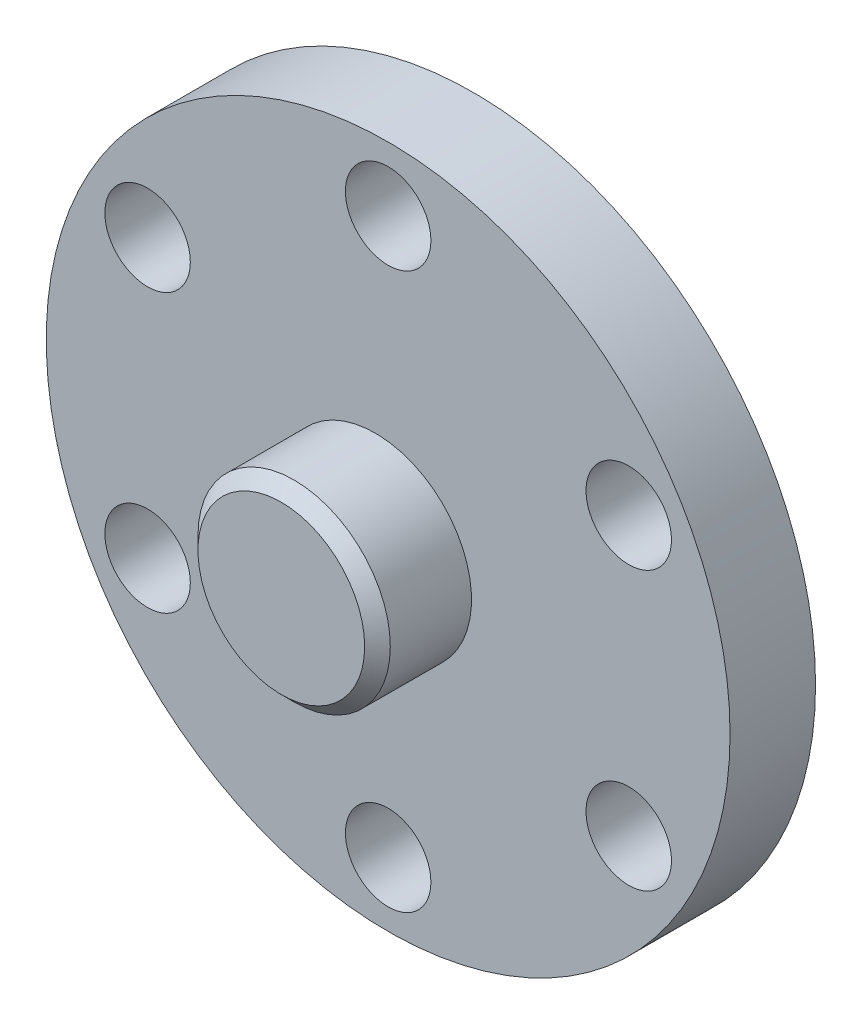
ISO-10303-21;
HEADER;
FILE_DESCRIPTION(('STEP AP214'),'2;1');
FILE_NAME('part.step','',(''),(''),'','','');
FILE_SCHEMA(('AUTOMOTIVE_DESIGN { 1 0 10303 214 1 1 1 1 }'));
ENDSEC;
DATA;
#1=APPLICATION_CONTEXT('core data for automotive mechanical design processes');
#2=APPLICATION_PROTOCOL_DEFINITION('international standard','automotive_design',2000,#1);
#3=PRODUCT_CONTEXT('',#1,'mechanical');
#4=PRODUCT('Part','Part','',(#3));
#5=PRODUCT_RELATED_PRODUCT_CATEGORY('part','',(#4));
#6=PRODUCT_DEFINITION_FORMATION('','',#4);
#7=PRODUCT_DEFINITION_CONTEXT('part definition',#1,'design');
#8=PRODUCT_DEFINITION('design','',#6,#7);
#9=PRODUCT_DEFINITION_SHAPE('','',#8);
#10=(LENGTH_UNIT() NAMED_UNIT(*) SI_UNIT(.MILLI.,.METRE.));
#11=(NAMED_UNIT(*) PLANE_ANGLE_UNIT() SI_UNIT($,.RADIAN.));
#12=(NAMED_UNIT(*) SI_UNIT($,.STERADIAN.) SOLID_ANGLE_UNIT());
#13=UNCERTAINTY_MEASURE_WITH_UNIT(LENGTH_MEASURE(1.E-05),#10,'distance_accuracy_value','');
#14=(GEOMETRIC_REPRESENTATION_CONTEXT(3) GLOBAL_UNCERTAINTY_ASSIGNED_CONTEXT((#13)) GLOBAL_UNIT_ASSIGNED_CONTEXT((#10,
#11,#12)) REPRESENTATION_CONTEXT('',''));
#15=CARTESIAN_POINT('',(0.,0.,0.));
#16=DIRECTION('',(0.,0.,1.));
#17=DIRECTION('',(1.,0.,0.));
#18=AXIS2_PLACEMENT_3D('',#15,#16,#17);
#19=CARTESIAN_POINT('',(0.,0.,20.));
#20=DIRECTION('',(0.,0.,-1.));
#21=DIRECTION('',(-1.,0.,0.));
#22=AXIS2_PLACEMENT_3D('',#19,#20,#21);
#23=CYLINDRICAL_SURFACE('',#22,80.);
#24=CARTESIAN_POINT('',(0.,0.,20.));
#25=DIRECTION('',(0.,0.,1.));
#26=DIRECTION('',(1.,0.,0.));
#27=AXIS2_PLACEMENT_3D('',#24,#25,#26);
#28=CIRCLE('',#27,80.);
#29=CARTESIAN_POINT('',(80.,0.,20.));
#30=VERTEX_POINT('',#29);
#31=EDGE_CURVE('E45',#30,#30,#28,.T.);
#32=ORIENTED_EDGE('',*,*,#31,.F.);
#33=EDGE_LOOP('',(#32));
#34=FACE_BOUND('',#33,.T.);
#35=CARTESIAN_POINT('',(0.,0.,0.));
#36=DIRECTION('',(0.,0.,1.));
#37=DIRECTION('',(1.,0.,0.));
#38=AXIS2_PLACEMENT_3D('',#35,#36,#37);
#39=CIRCLE('',#38,80.);
#40=CARTESIAN_POINT('',(80.,0.,0.));
#41=VERTEX_POINT('',#40);
#42=EDGE_CURVE('E48',#41,#41,#39,.T.);
#43=ORIENTED_EDGE('',*,*,#42,.T.);
#44=EDGE_LOOP('',(#43));
#45=FACE_BOUND('',#44,.T.);
#46=ADVANCED_FACE('F30',(#34,#45),#23,.T.);
#47=CARTESIAN_POINT('',(0.,0.,20.));
#48=DIRECTION('',(0.,0.,1.));
#49=DIRECTION('',(1.,0.,0.));
#50=AXIS2_PLACEMENT_3D('',#47,#48,#49);
#51=PLANE('',#50);
#52=CARTESIAN_POINT('',(-56.2916512459881,32.5000000000007,20.));
#53=DIRECTION('',(0.,0.,1.));
#54=DIRECTION('',(1.,0.,0.));
#55=AXIS2_PLACEMENT_3D('',#52,#53,#54);
#56=CIRCLE('',#55,10.);
#57=CARTESIAN_POINT('',(-46.2916512459881,32.5000000000007,20.));
#58=VERTEX_POINT('',#57);
#59=EDGE_CURVE('E92',#58,#58,#56,.T.);
#60=ORIENTED_EDGE('',*,*,#59,.F.);
#61=EDGE_LOOP('',(#60));
#62=FACE_BOUND('',#61,.T.);
#63=CARTESIAN_POINT('',(-56.2916512459888,-32.4999999999995,20.));
#64=DIRECTION('',(0.,0.,1.));
#65=DIRECTION('',(1.,0.,0.));
#66=AXIS2_PLACEMENT_3D('',#63,#64,#65);
#67=CIRCLE('',#66,9.99999999999999);
#68=CARTESIAN_POINT('',(-46.2916512459888,-32.4999999999995,20.));
#69=VERTEX_POINT('',#68);
#70=EDGE_CURVE('E86',#69,#69,#67,.T.);
#71=ORIENTED_EDGE('',*,*,#70,.F.);
#72=EDGE_LOOP('',(#71));
#73=FACE_BOUND('',#72,.T.);
#74=CARTESIAN_POINT('',(-4.53892574049607E-13,-65.,20.));
#75=DIRECTION('',(0.,0.,1.));
#76=DIRECTION('',(1.,0.,0.));
#77=AXIS2_PLACEMENT_3D('',#74,#75,#76);
#78=CIRCLE('',#77,10.);
#79=CARTESIAN_POINT('',(9.99999999999954,-65.,20.));
#80=VERTEX_POINT('',#79);
#81=EDGE_CURVE('E80',#80,#80,#78,.T.);
#82=ORIENTED_EDGE('',*,*,#81,.F.);
#83=EDGE_LOOP('',(#82));
#84=FACE_BOUND('',#83,.T.);
#85=CARTESIAN_POINT('',(56.2916512459884,-32.5000000000003,20.));
#86=DIRECTION('',(0.,0.,1.));
#87=DIRECTION('',(1.,0.,0.));
#88=AXIS2_PLACEMENT_3D('',#85,#86,#87);
#89=CIRCLE('',#88,10.);
#90=CARTESIAN_POINT('',(66.2916512459884,-32.5000000000003,20.));
#91=VERTEX_POINT('',#90);
#92=EDGE_CURVE('E74',#91,#91,#89,.T.);
#93=ORIENTED_EDGE('',*,*,#92,.F.);
#94=EDGE_LOOP('',(#93));
#95=FACE_BOUND('',#94,.T.);
#96=CARTESIAN_POINT('',(56.2916512459886,32.4999999999999,20.));
#97=DIRECTION('',(0.,0.,1.));
#98=DIRECTION('',(1.,0.,0.));
#99=AXIS2_PLACEMENT_3D('',#96,#97,#98);
#100=CIRCLE('',#99,9.99999999999999);
#101=CARTESIAN_POINT('',(66.2916512459886,32.4999999999999,20.));
#102=VERTEX_POINT('',#101);
#103=EDGE_CURVE('E68',#102,#102,#100,.T.);
#104=ORIENTED_EDGE('',*,*,#103,.F.);
#105=EDGE_LOOP('',(#104));
#106=FACE_BOUND('',#105,.T.);
#107=CARTESIAN_POINT('',(0.,65.,20.));
#108=DIRECTION('',(0.,0.,1.));
#109=DIRECTION('',(1.,0.,0.));
#110=AXIS2_PLACEMENT_3D('',#107,#108,#109);
#111=CIRCLE('',#110,10.);
#112=CARTESIAN_POINT('',(10.,65.,20.));
#113=VERTEX_POINT('',#112);
#114=EDGE_CURVE('E62',#113,#113,#111,.T.);
#115=ORIENTED_EDGE('',*,*,#114,.F.);
#116=EDGE_LOOP('',(#115));
#117=FACE_BOUND('',#116,.T.);
#118=CARTESIAN_POINT('',(0.,0.,20.));
#119=DIRECTION('',(0.,0.,1.));
#120=DIRECTION('',(1.,0.,0.));
#121=AXIS2_PLACEMENT_3D('',#118,#119,#120);
#122=CIRCLE('',#121,10.);
#123=CARTESIAN_POINT('',(10.,0.,20.));
#124=VERTEX_POINT('',#123);
#125=EDGE_CURVE('E41',#124,#124,#122,.T.);
#126=ORIENTED_EDGE('',*,*,#125,.F.);
#127=EDGE_LOOP('',(#126));
#128=FACE_BOUND('',#127,.T.);
#129=ORIENTED_EDGE('',*,*,#31,.T.);
#130=EDGE_LOOP('',(#129));
#131=FACE_BOUND('',#130,.T.);
#132=ADVANCED_FACE('F98',(#62,#73,#84,#95,#106,#117,#128,#131),#51,.T.);
#133=CARTESIAN_POINT('',(0.,0.,0.));
#134=DIRECTION('',(0.,0.,1.));
#135=DIRECTION('',(1.,0.,0.));
#136=AXIS2_PLACEMENT_3D('',#133,#134,#135);
#137=PLANE('',#136);
#138=CARTESIAN_POINT('',(-56.2916512459881,32.5000000000007,0.));
#139=DIRECTION('',(0.,0.,1.));
#140=DIRECTION('',(1.,0.,0.));
#141=AXIS2_PLACEMENT_3D('',#138,#139,#140);
#142=CIRCLE('',#141,9.99999999999999);
#143=CARTESIAN_POINT('',(-46.2916512459881,32.5000000000007,0.));
#144=VERTEX_POINT('',#143);
#145=EDGE_CURVE('E89',#144,#144,#142,.T.);
#146=ORIENTED_EDGE('',*,*,#145,.T.);
#147=EDGE_LOOP('',(#146));
#148=FACE_BOUND('',#147,.T.);
#149=CARTESIAN_POINT('',(-56.2916512459888,-32.4999999999995,0.));
#150=DIRECTION('',(0.,0.,1.));
#151=DIRECTION('',(1.,0.,0.));
#152=AXIS2_PLACEMENT_3D('',#149,#150,#151);
#153=CIRCLE('',#152,9.99999999999999);
#154=CARTESIAN_POINT('',(-46.2916512459888,-32.4999999999995,0.));
#155=VERTEX_POINT('',#154);
#156=EDGE_CURVE('E83',#155,#155,#153,.T.);
#157=ORIENTED_EDGE('',*,*,#156,.T.);
#158=EDGE_LOOP('',(#157));
#159=FACE_BOUND('',#158,.T.);
#160=CARTESIAN_POINT('',(-4.53892574049607E-13,-65.,0.));
#161=DIRECTION('',(0.,0.,1.));
#162=DIRECTION('',(1.,0.,0.));
#163=AXIS2_PLACEMENT_3D('',#160,#161,#162);
#164=CIRCLE('',#163,10.);
#165=CARTESIAN_POINT('',(9.99999999999954,-65.,0.));
#166=VERTEX_POINT('',#165);
#167=EDGE_CURVE('E77',#166,#166,#164,.T.);
#168=ORIENTED_EDGE('',*,*,#167,.T.);
#169=EDGE_LOOP('',(#168));
#170=FACE_BOUND('',#169,.T.);
#171=CARTESIAN_POINT('',(56.2916512459884,-32.5000000000003,0.));
#172=DIRECTION('',(0.,0.,1.));
#173=DIRECTION('',(1.,0.,0.));
#174=AXIS2_PLACEMENT_3D('',#171,#172,#173);
#175=CIRCLE('',#174,10.);
#176=CARTESIAN_POINT('',(66.2916512459884,-32.5000000000003,0.));
#177=VERTEX_POINT('',#176);
#178=EDGE_CURVE('E71',#177,#177,#175,.T.);
#179=ORIENTED_EDGE('',*,*,#178,.T.);
#180=EDGE_LOOP('',(#179));
#181=FACE_BOUND('',#180,.T.);
#182=CARTESIAN_POINT('',(56.2916512459886,32.4999999999999,0.));
#183=DIRECTION('',(0.,0.,1.));
#184=DIRECTION('',(1.,0.,0.));
#185=AXIS2_PLACEMENT_3D('',#182,#183,#184);
#186=CIRCLE('',#185,9.99999999999999);
#187=CARTESIAN_POINT('',(66.2916512459886,32.4999999999999,0.));
#188=VERTEX_POINT('',#187);
#189=EDGE_CURVE('E65',#188,#188,#186,.T.);
#190=ORIENTED_EDGE('',*,*,#189,.T.);
#191=EDGE_LOOP('',(#190));
#192=FACE_BOUND('',#191,.T.);
#193=CARTESIAN_POINT('',(0.,65.,0.));
#194=DIRECTION('',(0.,0.,1.));
#195=DIRECTION('',(1.,0.,0.));
#196=AXIS2_PLACEMENT_3D('',#193,#194,#195);
#197=CIRCLE('',#196,10.);
#198=CARTESIAN_POINT('',(10.,65.,0.));
#199=VERTEX_POINT('',#198);
#200=EDGE_CURVE('E59',#199,#199,#197,.T.);
#201=ORIENTED_EDGE('',*,*,#200,.T.);
#202=EDGE_LOOP('',(#201));
#203=FACE_BOUND('',#202,.T.);
#204=ORIENTED_EDGE('',*,*,#42,.F.);
#205=EDGE_LOOP('',(#204));
#206=FACE_BOUND('',#205,.T.);
#207=ADVANCED_FACE('F101',(#148,#159,#170,#181,#192,#203,#206),#137,.F.);
#208=CARTESIAN_POINT('',(-22.5,0.,45.));
#209=DIRECTION('',(0.,0.,1.));
#210=DIRECTION('',(1.,0.,0.));
#211=AXIS2_PLACEMENT_3D('',#208,#209,#210);
#212=PLANE('',#211);
#213=CARTESIAN_POINT('',(0.,0.,45.));
#214=DIRECTION('',(0.,0.,1.));
#215=DIRECTION('',(1.,0.,0.));
#216=AXIS2_PLACEMENT_3D('',#213,#214,#215);
#217=CIRCLE('',#216,19.5);
#218=CARTESIAN_POINT('',(19.5,0.,45.));
#219=VERTEX_POINT('',#218);
#220=EDGE_CURVE('E10',#219,#219,#217,.T.);
#221=ORIENTED_EDGE('',*,*,#220,.T.);
#222=EDGE_LOOP('',(#221));
#223=FACE_BOUND('',#222,.T.);
#224=ADVANCED_FACE('F122',(#223),#212,.T.);
#225=CARTESIAN_POINT('',(0.,0.,0.));
#226=DIRECTION('',(0.,0.,-1.));
#227=DIRECTION('',(-1.,0.,0.));
#228=AXIS2_PLACEMENT_3D('',#225,#226,#227);
#229=CYLINDRICAL_SURFACE('',#228,22.5);
#230=CARTESIAN_POINT('',(0.,0.,42.));
#231=DIRECTION('',(0.,0.,1.));
#232=DIRECTION('',(1.,0.,0.));
#233=AXIS2_PLACEMENT_3D('',#230,#231,#232);
#234=CIRCLE('',#233,22.5);
#235=CARTESIAN_POINT('',(22.5,0.,42.));
#236=VERTEX_POINT('',#235);
#237=EDGE_CURVE('E37',#236,#236,#234,.F.);
#238=ORIENTED_EDGE('',*,*,#237,.T.);
#239=EDGE_LOOP('',(#238));
#240=FACE_BOUND('',#239,.T.);
#241=CARTESIAN_POINT('',(0.,0.,23.));
#242=DIRECTION('',(0.,0.,-1.));
#243=DIRECTION('',(-1.,0.,0.));
#244=AXIS2_PLACEMENT_3D('',#241,#242,#243);
#245=CIRCLE('',#244,22.5);
#246=CARTESIAN_POINT('',(-22.5,0.,23.));
#247=VERTEX_POINT('',#246);
#248=EDGE_CURVE('E51',#247,#247,#245,.T.);
#249=ORIENTED_EDGE('',*,*,#248,.F.);
#250=EDGE_LOOP('',(#249));
#251=FACE_BOUND('',#250,.T.);
#252=ADVANCED_FACE('F128',(#240,#251),#229,.T.);
#253=CARTESIAN_POINT('',(-10.,0.,23.));
#254=DIRECTION('',(0.,0.,-1.));
#255=DIRECTION('',(-1.,0.,0.));
#256=AXIS2_PLACEMENT_3D('',#253,#254,#255);
#257=PLANE('',#256);
#258=ORIENTED_EDGE('',*,*,#248,.T.);
#259=EDGE_LOOP('',(#258));
#260=FACE_BOUND('',#259,.T.);
#261=CARTESIAN_POINT('',(0.,0.,23.));
#262=DIRECTION('',(0.,0.,-1.));
#263=DIRECTION('',(-1.,0.,0.));
#264=AXIS2_PLACEMENT_3D('',#261,#262,#263);
#265=CIRCLE('',#264,10.);
#266=CARTESIAN_POINT('',(-10.,0.,23.));
#267=VERTEX_POINT('',#266);
#268=EDGE_CURVE('E56',#267,#267,#265,.T.);
#269=ORIENTED_EDGE('',*,*,#268,.F.);
#270=EDGE_LOOP('',(#269));
#271=FACE_BOUND('',#270,.T.);
#272=ADVANCED_FACE('F134',(#260,#271),#257,.T.);
#273=CARTESIAN_POINT('',(0.,0.,0.));
#274=DIRECTION('',(0.,0.,-1.));
#275=DIRECTION('',(-1.,0.,0.));
#276=AXIS2_PLACEMENT_3D('',#273,#274,#275);
#277=CYLINDRICAL_SURFACE('',#276,10.);
#278=ORIENTED_EDGE('',*,*,#268,.T.);
#279=EDGE_LOOP('',(#278));
#280=FACE_BOUND('',#279,.T.);
#281=ORIENTED_EDGE('',*,*,#125,.T.);
#282=EDGE_LOOP('',(#281));
#283=FACE_BOUND('',#282,.T.);
#284=ADVANCED_FACE('F137',(#280,#283),#277,.T.);
#285=CARTESIAN_POINT('',(0.,0.,42.));
#286=DIRECTION('',(0.,0.,-1.));
#287=DIRECTION('',(-1.,0.,0.));
#288=AXIS2_PLACEMENT_3D('',#285,#286,#287);
#289=CONICAL_SURFACE('',#288,22.5,0.785398163397443);
#290=ORIENTED_EDGE('',*,*,#220,.F.);
#291=EDGE_LOOP('',(#290));
#292=FACE_BOUND('',#291,.T.);
#293=ORIENTED_EDGE('',*,*,#237,.F.);
#294=EDGE_LOOP('',(#293));
#295=FACE_BOUND('',#294,.T.);
#296=ADVANCED_FACE('F32',(#292,#295),#289,.T.);
#297=CARTESIAN_POINT('',(0.,65.,20.));
#298=DIRECTION('',(0.,0.,1.));
#299=DIRECTION('',(1.,0.,0.));
#300=AXIS2_PLACEMENT_3D('',#297,#298,#299);
#301=CYLINDRICAL_SURFACE('',#300,10.);
#302=ORIENTED_EDGE('',*,*,#200,.F.);
#303=EDGE_LOOP('',(#302));
#304=FACE_BOUND('',#303,.T.);
#305=ORIENTED_EDGE('',*,*,#114,.T.);
#306=EDGE_LOOP('',(#305));
#307=FACE_BOUND('',#306,.T.);
#308=ADVANCED_FACE('F142',(#304,#307),#301,.F.);
#309=CARTESIAN_POINT('',(56.2916512459886,32.4999999999999,20.));
#310=DIRECTION('',(0.,0.,1.));
#311=DIRECTION('',(1.,0.,0.));
#312=AXIS2_PLACEMENT_3D('',#309,#310,#311);
#313=CYLINDRICAL_SURFACE('',#312,9.99999999999999);
#314=ORIENTED_EDGE('',*,*,#189,.F.);
#315=EDGE_LOOP('',(#314));
#316=FACE_BOUND('',#315,.T.);
#317=ORIENTED_EDGE('',*,*,#103,.T.);
#318=EDGE_LOOP('',(#317));
#319=FACE_BOUND('',#318,.T.);
#320=ADVANCED_FACE('F145',(#316,#319),#313,.F.);
#321=CARTESIAN_POINT('',(56.2916512459884,-32.5000000000003,20.));
#322=DIRECTION('',(0.,0.,1.));
#323=DIRECTION('',(1.,0.,0.));
#324=AXIS2_PLACEMENT_3D('',#321,#322,#323);
#325=CYLINDRICAL_SURFACE('',#324,10.);
#326=ORIENTED_EDGE('',*,*,#178,.F.);
#327=EDGE_LOOP('',(#326));
#328=FACE_BOUND('',#327,.T.);
#329=ORIENTED_EDGE('',*,*,#92,.T.);
#330=EDGE_LOOP('',(#329));
#331=FACE_BOUND('',#330,.T.);
#332=ADVANCED_FACE('F149',(#328,#331),#325,.F.);
#333=CARTESIAN_POINT('',(-4.53892574049607E-13,-65.,20.));
#334=DIRECTION('',(0.,0.,1.));
#335=DIRECTION('',(1.,0.,0.));
#336=AXIS2_PLACEMENT_3D('',#333,#334,#335);
#337=CYLINDRICAL_SURFACE('',#336,10.);
#338=ORIENTED_EDGE('',*,*,#167,.F.);
#339=EDGE_LOOP('',(#338));
#340=FACE_BOUND('',#339,.T.);
#341=ORIENTED_EDGE('',*,*,#81,.T.);
#342=EDGE_LOOP('',(#341));
#343=FACE_BOUND('',#342,.T.);
#344=ADVANCED_FACE('F153',(#340,#343),#337,.F.);
#345=CARTESIAN_POINT('',(-56.2916512459888,-32.4999999999995,20.));
#346=DIRECTION('',(0.,0.,1.));
#347=DIRECTION('',(1.,0.,0.));
#348=AXIS2_PLACEMENT_3D('',#345,#346,#347);
#349=CYLINDRICAL_SURFACE('',#348,9.99999999999999);
#350=ORIENTED_EDGE('',*,*,#156,.F.);
#351=EDGE_LOOP('',(#350));
#352=FACE_BOUND('',#351,.T.);
#353=ORIENTED_EDGE('',*,*,#70,.T.);
#354=EDGE_LOOP('',(#353));
#355=FACE_BOUND('',#354,.T.);
#356=ADVANCED_FACE('F157',(#352,#355),#349,.F.);
#357=CARTESIAN_POINT('',(-56.2916512459881,32.5000000000007,20.));
#358=DIRECTION('',(0.,0.,1.));
#359=DIRECTION('',(1.,0.,0.));
#360=AXIS2_PLACEMENT_3D('',#357,#358,#359);
#361=CYLINDRICAL_SURFACE('',#360,10.);
#362=ORIENTED_EDGE('',*,*,#145,.F.);
#363=EDGE_LOOP('',(#362));
#364=FACE_BOUND('',#363,.T.);
#365=ORIENTED_EDGE('',*,*,#59,.T.);
#366=EDGE_LOOP('',(#365));
#367=FACE_BOUND('',#366,.T.);
#368=ADVANCED_FACE('F96',(#364,#367),#361,.F.);
#369=CLOSED_SHELL('',(#46,#132,#207,#224,#252,#272,#284,#296,#308,#320,#332,#344,#356,#368));
#370=MANIFOLD_SOLID_BREP('B2',#369);
#371=ADVANCED_BREP_SHAPE_REPRESENTATION('',(#18,#370),#14);
#372=SHAPE_DEFINITION_REPRESENTATION(#9,#371);
ENDSEC;
END-ISO-10303-21;
